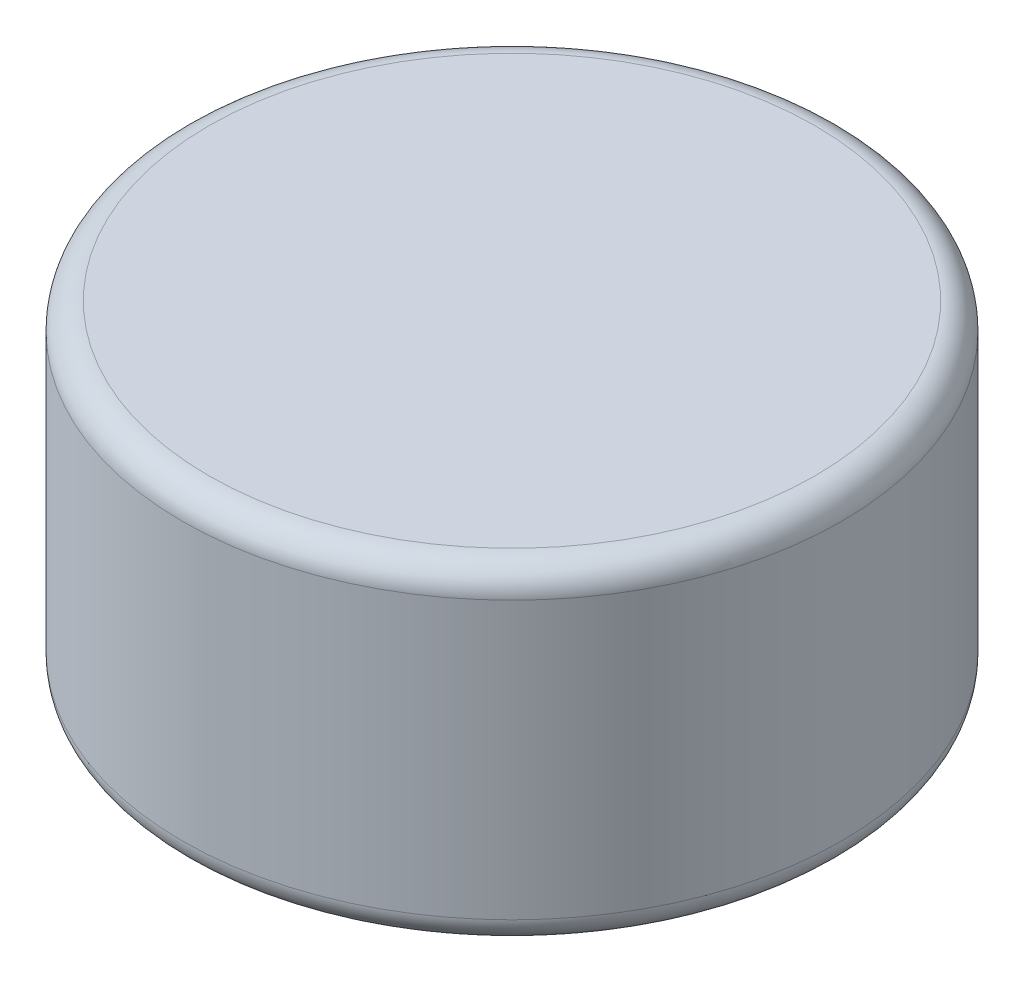
ISO-10303-21;
HEADER;
FILE_DESCRIPTION(('STEP AP214'),'2;1');
FILE_NAME('part.step','',(''),(''),'','','');
FILE_SCHEMA(('AUTOMOTIVE_DESIGN { 1 0 10303 214 1 1 1 1 }'));
ENDSEC;
DATA;
#1=APPLICATION_CONTEXT('core data for automotive mechanical design processes');
#2=APPLICATION_PROTOCOL_DEFINITION('international standard','automotive_design',2000,#1);
#3=PRODUCT_CONTEXT('',#1,'mechanical');
#4=PRODUCT('Part','Part','',(#3));
#5=PRODUCT_RELATED_PRODUCT_CATEGORY('part','',(#4));
#6=PRODUCT_DEFINITION_FORMATION('','',#4);
#7=PRODUCT_DEFINITION_CONTEXT('part definition',#1,'design');
#8=PRODUCT_DEFINITION('design','',#6,#7);
#9=PRODUCT_DEFINITION_SHAPE('','',#8);
#10=(LENGTH_UNIT() NAMED_UNIT(*) SI_UNIT(.MILLI.,.METRE.));
#11=(NAMED_UNIT(*) PLANE_ANGLE_UNIT() SI_UNIT($,.RADIAN.));
#12=(NAMED_UNIT(*) SI_UNIT($,.STERADIAN.) SOLID_ANGLE_UNIT());
#13=UNCERTAINTY_MEASURE_WITH_UNIT(LENGTH_MEASURE(1.E-05),#10,'distance_accuracy_value','');
#14=(GEOMETRIC_REPRESENTATION_CONTEXT(3) GLOBAL_UNCERTAINTY_ASSIGNED_CONTEXT((#13)) GLOBAL_UNIT_ASSIGNED_CONTEXT((#10,
#11,#12)) REPRESENTATION_CONTEXT('',''));
#15=CARTESIAN_POINT('',(0.,0.,0.));
#16=DIRECTION('',(0.,0.,1.));
#17=DIRECTION('',(1.,0.,0.));
#18=AXIS2_PLACEMENT_3D('',#15,#16,#17);
#19=CARTESIAN_POINT('',(0.,3.175,0.));
#20=DIRECTION('',(0.,-1.,0.));
#21=DIRECTION('',(0.,0.,-1.));
#22=AXIS2_PLACEMENT_3D('',#19,#20,#21);
#23=CYLINDRICAL_SURFACE('',#22,3.175);
#24=CARTESIAN_POINT('',(0.,0.253999999999997,0.));
#25=DIRECTION('',(0.,1.,0.));
#26=DIRECTION('',(0.,0.,1.));
#27=AXIS2_PLACEMENT_3D('',#24,#25,#26);
#28=CIRCLE('',#27,3.175);
#29=CARTESIAN_POINT('',(0.,0.253999999999997,3.175));
#30=VERTEX_POINT('',#29);
#31=EDGE_CURVE('E45',#30,#30,#28,.T.);
#32=ORIENTED_EDGE('',*,*,#31,.T.);
#33=EDGE_LOOP('',(#32));
#34=FACE_BOUND('',#33,.T.);
#35=CARTESIAN_POINT('',(0.,2.921,0.));
#36=DIRECTION('',(0.,1.,0.));
#37=DIRECTION('',(0.,0.,1.));
#38=AXIS2_PLACEMENT_3D('',#35,#36,#37);
#39=CIRCLE('',#38,3.175);
#40=CARTESIAN_POINT('',(0.,2.921,3.175));
#41=VERTEX_POINT('',#40);
#42=EDGE_CURVE('E49',#41,#41,#39,.F.);
#43=ORIENTED_EDGE('',*,*,#42,.T.);
#44=EDGE_LOOP('',(#43));
#45=FACE_BOUND('',#44,.T.);
#46=ADVANCED_FACE('F34',(#34,#45),#23,.T.);
#47=CARTESIAN_POINT('',(0.,3.175,0.));
#48=DIRECTION('',(0.,1.,0.));
#49=DIRECTION('',(0.,0.,1.));
#50=AXIS2_PLACEMENT_3D('',#47,#48,#49);
#51=PLANE('',#50);
#52=CARTESIAN_POINT('',(0.,3.175,0.));
#53=DIRECTION('',(0.,1.,0.));
#54=DIRECTION('',(0.,0.,1.));
#55=AXIS2_PLACEMENT_3D('',#52,#53,#54);
#56=CIRCLE('',#55,2.921);
#57=CARTESIAN_POINT('',(0.,3.175,2.921));
#58=VERTEX_POINT('',#57);
#59=EDGE_CURVE('E10',#58,#58,#56,.T.);
#60=ORIENTED_EDGE('',*,*,#59,.T.);
#61=EDGE_LOOP('',(#60));
#62=FACE_BOUND('',#61,.T.);
#63=ADVANCED_FACE('F65',(#62),#51,.T.);
#64=CARTESIAN_POINT('',(0.,0.,0.));
#65=DIRECTION('',(0.,1.,0.));
#66=DIRECTION('',(0.,0.,1.));
#67=AXIS2_PLACEMENT_3D('',#64,#65,#66);
#68=PLANE('',#67);
#69=CARTESIAN_POINT('',(0.,0.,0.));
#70=DIRECTION('',(0.,1.,0.));
#71=DIRECTION('',(0.,0.,1.));
#72=AXIS2_PLACEMENT_3D('',#69,#70,#71);
#73=CIRCLE('',#72,2.921);
#74=CARTESIAN_POINT('',(0.,0.,2.921));
#75=VERTEX_POINT('',#74);
#76=EDGE_CURVE('E41',#75,#75,#73,.F.);
#77=ORIENTED_EDGE('',*,*,#76,.T.);
#78=EDGE_LOOP('',(#77));
#79=FACE_BOUND('',#78,.T.);
#80=ADVANCED_FACE('F62',(#79),#68,.F.);
#81=CARTESIAN_POINT('',(0.,0.253999999999997,0.));
#82=DIRECTION('',(0.,1.,0.));
#83=DIRECTION('',(0.,0.,1.));
#84=AXIS2_PLACEMENT_3D('',#81,#82,#83);
#85=TOROIDAL_SURFACE('',#84,2.921,0.254);
#86=ORIENTED_EDGE('',*,*,#76,.F.);
#87=EDGE_LOOP('',(#86));
#88=FACE_BOUND('',#87,.T.);
#89=ORIENTED_EDGE('',*,*,#31,.F.);
#90=EDGE_LOOP('',(#89));
#91=FACE_BOUND('',#90,.T.);
#92=ADVANCED_FACE('F58',(#88,#91),#85,.T.);
#93=CARTESIAN_POINT('',(0.,2.921,0.));
#94=DIRECTION('',(0.,1.,0.));
#95=DIRECTION('',(0.,0.,1.));
#96=AXIS2_PLACEMENT_3D('',#93,#94,#95);
#97=TOROIDAL_SURFACE('',#96,2.921,0.254);
#98=ORIENTED_EDGE('',*,*,#42,.F.);
#99=EDGE_LOOP('',(#98));
#100=FACE_BOUND('',#99,.T.);
#101=ORIENTED_EDGE('',*,*,#59,.F.);
#102=EDGE_LOOP('',(#101));
#103=FACE_BOUND('',#102,.T.);
#104=ADVANCED_FACE('F36',(#100,#103),#97,.T.);
#105=CLOSED_SHELL('',(#46,#63,#80,#92,#104));
#106=MANIFOLD_SOLID_BREP('B2',#105);
#107=ADVANCED_BREP_SHAPE_REPRESENTATION('',(#18,#106),#14);
#108=SHAPE_DEFINITION_REPRESENTATION(#9,#107);
ENDSEC;
END-ISO-10303-21;
